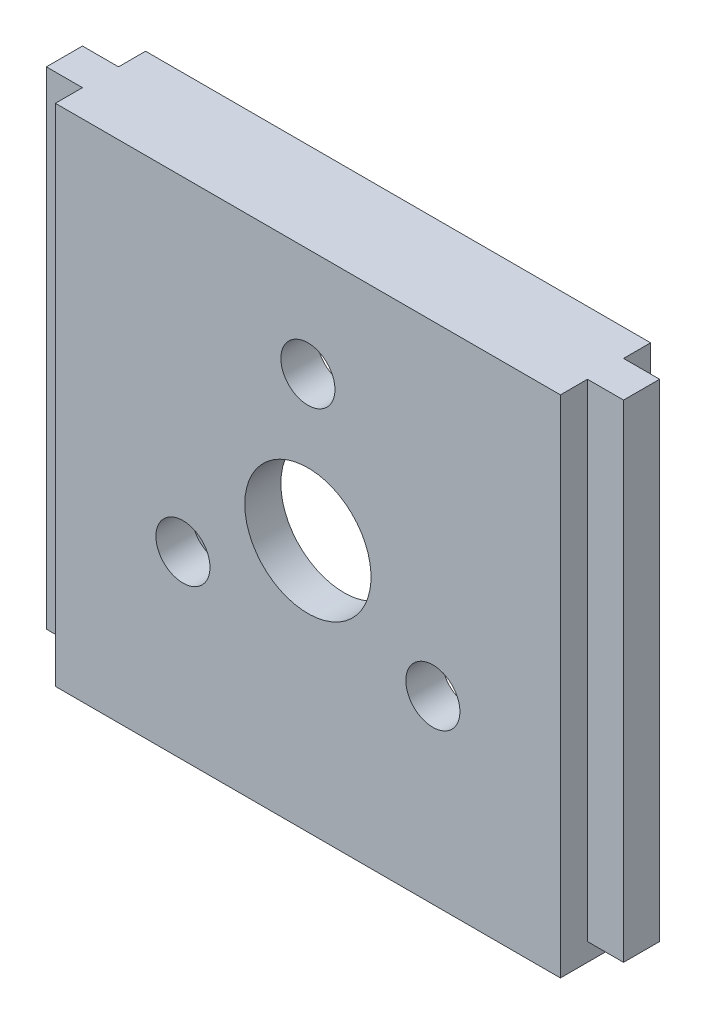
ISO-10303-21;
HEADER;
FILE_DESCRIPTION(('STEP AP214'),'2;1');
FILE_NAME('part.step','',(''),(''),'','','');
FILE_SCHEMA(('AUTOMOTIVE_DESIGN { 1 0 10303 214 1 1 1 1 }'));
ENDSEC;
DATA;
#1=APPLICATION_CONTEXT('core data for automotive mechanical design processes');
#2=APPLICATION_PROTOCOL_DEFINITION('international standard','automotive_design',2000,#1);
#3=PRODUCT_CONTEXT('',#1,'mechanical');
#4=PRODUCT('Part','Part','',(#3));
#5=PRODUCT_RELATED_PRODUCT_CATEGORY('part','',(#4));
#6=PRODUCT_DEFINITION_FORMATION('','',#4);
#7=PRODUCT_DEFINITION_CONTEXT('part definition',#1,'design');
#8=PRODUCT_DEFINITION('design','',#6,#7);
#9=PRODUCT_DEFINITION_SHAPE('','',#8);
#10=(LENGTH_UNIT() NAMED_UNIT(*) SI_UNIT(.MILLI.,.METRE.));
#11=(NAMED_UNIT(*) PLANE_ANGLE_UNIT() SI_UNIT($,.RADIAN.));
#12=(NAMED_UNIT(*) SI_UNIT($,.STERADIAN.) SOLID_ANGLE_UNIT());
#13=UNCERTAINTY_MEASURE_WITH_UNIT(LENGTH_MEASURE(1.E-05),#10,'distance_accuracy_value','');
#14=(GEOMETRIC_REPRESENTATION_CONTEXT(3) GLOBAL_UNCERTAINTY_ASSIGNED_CONTEXT((#13)) GLOBAL_UNIT_ASSIGNED_CONTEXT((#10,
#11,#12)) REPRESENTATION_CONTEXT('',''));
#15=CARTESIAN_POINT('',(0.,0.,0.));
#16=DIRECTION('',(0.,0.,1.));
#17=DIRECTION('',(1.,0.,0.));
#18=AXIS2_PLACEMENT_3D('',#15,#16,#17);
#19=CARTESIAN_POINT('',(14.,14.,0.));
#20=DIRECTION('',(0.,0.,1.));
#21=DIRECTION('',(1.,0.,0.));
#22=AXIS2_PLACEMENT_3D('',#19,#20,#21);
#23=CYLINDRICAL_SURFACE('',#22,3.5);
#24=CARTESIAN_POINT('',(14.,14.,5.));
#25=DIRECTION('',(0.,0.,-1.));
#26=DIRECTION('',(-1.,0.,0.));
#27=AXIS2_PLACEMENT_3D('',#24,#25,#26);
#28=CIRCLE('',#27,3.5);
#29=CARTESIAN_POINT('',(10.5,14.,5.));
#30=VERTEX_POINT('',#29);
#31=EDGE_CURVE('E186',#30,#30,#28,.T.);
#32=ORIENTED_EDGE('',*,*,#31,.F.);
#33=EDGE_LOOP('',(#32));
#34=FACE_BOUND('',#33,.T.);
#35=CARTESIAN_POINT('',(14.,14.,3.));
#36=DIRECTION('',(0.,0.,-1.));
#37=DIRECTION('',(-1.,0.,0.));
#38=AXIS2_PLACEMENT_3D('',#35,#36,#37);
#39=CIRCLE('',#38,3.5);
#40=CARTESIAN_POINT('',(10.5,14.,3.));
#41=VERTEX_POINT('',#40);
#42=EDGE_CURVE('E448',#41,#41,#39,.F.);
#43=ORIENTED_EDGE('',*,*,#42,.F.);
#44=EDGE_LOOP('',(#43));
#45=FACE_BOUND('',#44,.T.);
#46=ADVANCED_FACE('F33',(#34,#45),#23,.F.);
#47=CARTESIAN_POINT('',(7.07179676972451,9.99999999999996,5.));
#48=DIRECTION('',(0.,0.,-1.));
#49=DIRECTION('',(-1.,0.,0.));
#50=AXIS2_PLACEMENT_3D('',#47,#48,#49);
#51=CYLINDRICAL_SURFACE('',#50,1.5);
#52=CARTESIAN_POINT('',(7.07179676972451,9.99999999999996,5.));
#53=DIRECTION('',(0.,0.,-1.));
#54=DIRECTION('',(-1.,0.,0.));
#55=AXIS2_PLACEMENT_3D('',#52,#53,#54);
#56=CIRCLE('',#55,1.5);
#57=CARTESIAN_POINT('',(5.57179676972451,9.99999999999996,5.));
#58=VERTEX_POINT('',#57);
#59=EDGE_CURVE('E151',#58,#58,#56,.T.);
#60=ORIENTED_EDGE('',*,*,#59,.F.);
#61=EDGE_LOOP('',(#60));
#62=FACE_BOUND('',#61,.T.);
#63=CARTESIAN_POINT('',(7.07179676972451,9.99999999999996,3.));
#64=DIRECTION('',(0.,0.,-1.));
#65=DIRECTION('',(-1.,0.,0.));
#66=AXIS2_PLACEMENT_3D('',#63,#64,#65);
#67=CIRCLE('',#66,1.5);
#68=CARTESIAN_POINT('',(5.57179676972451,9.99999999999996,3.));
#69=VERTEX_POINT('',#68);
#70=EDGE_CURVE('E445',#69,#69,#67,.F.);
#71=ORIENTED_EDGE('',*,*,#70,.F.);
#72=EDGE_LOOP('',(#71));
#73=FACE_BOUND('',#72,.T.);
#74=ADVANCED_FACE('F271',(#62,#73),#51,.F.);
#75=CARTESIAN_POINT('',(20.9282032302755,9.99999999999996,5.));
#76=DIRECTION('',(0.,0.,-1.));
#77=DIRECTION('',(-1.,0.,0.));
#78=AXIS2_PLACEMENT_3D('',#75,#76,#77);
#79=CYLINDRICAL_SURFACE('',#78,1.5);
#80=CARTESIAN_POINT('',(20.9282032302755,9.99999999999996,5.));
#81=DIRECTION('',(0.,0.,-1.));
#82=DIRECTION('',(-1.,0.,0.));
#83=AXIS2_PLACEMENT_3D('',#80,#81,#82);
#84=CIRCLE('',#83,1.5);
#85=CARTESIAN_POINT('',(19.4282032302755,9.99999999999996,5.));
#86=VERTEX_POINT('',#85);
#87=EDGE_CURVE('E452',#86,#86,#84,.T.);
#88=ORIENTED_EDGE('',*,*,#87,.F.);
#89=EDGE_LOOP('',(#88));
#90=FACE_BOUND('',#89,.T.);
#91=CARTESIAN_POINT('',(20.9282032302755,9.99999999999996,3.));
#92=DIRECTION('',(0.,0.,-1.));
#93=DIRECTION('',(-1.,0.,0.));
#94=AXIS2_PLACEMENT_3D('',#91,#92,#93);
#95=CIRCLE('',#94,1.5);
#96=CARTESIAN_POINT('',(19.4282032302755,9.99999999999996,3.));
#97=VERTEX_POINT('',#96);
#98=EDGE_CURVE('E442',#97,#97,#95,.F.);
#99=ORIENTED_EDGE('',*,*,#98,.F.);
#100=EDGE_LOOP('',(#99));
#101=FACE_BOUND('',#100,.T.);
#102=ADVANCED_FACE('F277',(#90,#101),#79,.F.);
#103=CARTESIAN_POINT('',(14.,22.,5.));
#104=DIRECTION('',(0.,0.,-1.));
#105=DIRECTION('',(-1.,0.,0.));
#106=AXIS2_PLACEMENT_3D('',#103,#104,#105);
#107=CYLINDRICAL_SURFACE('',#106,1.5);
#108=CARTESIAN_POINT('',(14.,22.,5.));
#109=DIRECTION('',(0.,0.,-1.));
#110=DIRECTION('',(-1.,0.,0.));
#111=AXIS2_PLACEMENT_3D('',#108,#109,#110);
#112=CIRCLE('',#111,1.5);
#113=CARTESIAN_POINT('',(12.5,22.,5.));
#114=VERTEX_POINT('',#113);
#115=EDGE_CURVE('E157',#114,#114,#112,.T.);
#116=ORIENTED_EDGE('',*,*,#115,.F.);
#117=EDGE_LOOP('',(#116));
#118=FACE_BOUND('',#117,.T.);
#119=CARTESIAN_POINT('',(14.,22.,3.));
#120=DIRECTION('',(0.,0.,-1.));
#121=DIRECTION('',(-1.,0.,0.));
#122=AXIS2_PLACEMENT_3D('',#119,#120,#121);
#123=CIRCLE('',#122,1.5);
#124=CARTESIAN_POINT('',(12.5,22.,3.));
#125=VERTEX_POINT('',#124);
#126=EDGE_CURVE('E37',#125,#125,#123,.F.);
#127=ORIENTED_EDGE('',*,*,#126,.F.);
#128=EDGE_LOOP('',(#127));
#129=FACE_BOUND('',#128,.T.);
#130=ADVANCED_FACE('F290',(#118,#129),#107,.F.);
#131=CARTESIAN_POINT('',(28.,0.,5.));
#132=DIRECTION('',(-1.,0.,0.));
#133=DIRECTION('',(0.,-1.,0.));
#134=AXIS2_PLACEMENT_3D('',#131,#132,#133);
#135=PLANE('',#134);
#136=DIRECTION('',(0.,1.,0.));
#137=VECTOR('',#136,1.);
#138=CARTESIAN_POINT('',(28.,1.,1.5));
#139=LINE('',#138,#137);
#140=CARTESIAN_POINT('',(28.,1.,1.5));
#141=VERTEX_POINT('',#140);
#142=CARTESIAN_POINT('',(28.,28.,1.5));
#143=VERTEX_POINT('',#142);
#144=EDGE_CURVE('E144',#141,#143,#139,.T.);
#145=ORIENTED_EDGE('',*,*,#144,.F.);
#146=DIRECTION('',(0.,0.,1.));
#147=VECTOR('',#146,1.);
#148=CARTESIAN_POINT('',(28.,1.,1.5));
#149=LINE('',#148,#147);
#150=CARTESIAN_POINT('',(28.,1.,3.5));
#151=VERTEX_POINT('',#150);
#152=EDGE_CURVE('E136',#141,#151,#149,.T.);
#153=ORIENTED_EDGE('',*,*,#152,.T.);
#154=DIRECTION('',(0.,1.,0.));
#155=VECTOR('',#154,1.);
#156=CARTESIAN_POINT('',(28.,1.,3.5));
#157=LINE('',#156,#155);
#158=CARTESIAN_POINT('',(28.,28.,3.5));
#159=VERTEX_POINT('',#158);
#160=EDGE_CURVE('E121',#151,#159,#157,.T.);
#161=ORIENTED_EDGE('',*,*,#160,.T.);
#162=DIRECTION('',(0.,0.,-1.));
#163=VECTOR('',#162,1.);
#164=CARTESIAN_POINT('',(28.,28.,5.));
#165=LINE('',#164,#163);
#166=CARTESIAN_POINT('',(28.,28.,5.));
#167=VERTEX_POINT('',#166);
#168=EDGE_CURVE('E219',#167,#159,#165,.T.);
#169=ORIENTED_EDGE('',*,*,#168,.F.);
#170=DIRECTION('',(0.,1.,0.));
#171=VECTOR('',#170,1.);
#172=CARTESIAN_POINT('',(28.,0.,5.));
#173=LINE('',#172,#171);
#174=CARTESIAN_POINT('',(28.,0.,5.));
#175=VERTEX_POINT('',#174);
#176=EDGE_CURVE('E201',#175,#167,#173,.T.);
#177=ORIENTED_EDGE('',*,*,#176,.F.);
#178=DIRECTION('',(0.,0.,-1.));
#179=VECTOR('',#178,1.);
#180=CARTESIAN_POINT('',(28.,0.,5.));
#181=LINE('',#180,#179);
#182=CARTESIAN_POINT('',(28.,0.,0.));
#183=VERTEX_POINT('',#182);
#184=EDGE_CURVE('E42',#175,#183,#181,.T.);
#185=ORIENTED_EDGE('',*,*,#184,.T.);
#186=DIRECTION('',(0.,1.,0.));
#187=VECTOR('',#186,1.);
#188=CARTESIAN_POINT('',(28.,0.,0.));
#189=LINE('',#188,#187);
#190=CARTESIAN_POINT('',(28.,28.,0.));
#191=VERTEX_POINT('',#190);
#192=EDGE_CURVE('E210',#183,#191,#189,.T.);
#193=ORIENTED_EDGE('',*,*,#192,.T.);
#194=EDGE_CURVE('E218',#143,#191,#165,.T.);
#195=ORIENTED_EDGE('',*,*,#194,.F.);
#196=EDGE_LOOP('',(#145,#153,#161,#169,#177,#185,#193,#195));
#197=FACE_BOUND('',#196,.T.);
#198=ADVANCED_FACE('F142',(#197),#135,.F.);
#199=CARTESIAN_POINT('',(0.,0.,5.));
#200=DIRECTION('',(1.,0.,0.));
#201=DIRECTION('',(0.,1.,0.));
#202=AXIS2_PLACEMENT_3D('',#199,#200,#201);
#203=PLANE('',#202);
#204=DIRECTION('',(0.,1.,0.));
#205=VECTOR('',#204,1.);
#206=CARTESIAN_POINT('',(0.,1.,3.5));
#207=LINE('',#206,#205);
#208=CARTESIAN_POINT('',(0.,1.,3.5));
#209=VERTEX_POINT('',#208);
#210=CARTESIAN_POINT('',(0.,28.,3.5));
#211=VERTEX_POINT('',#210);
#212=EDGE_CURVE('E184',#209,#211,#207,.T.);
#213=ORIENTED_EDGE('',*,*,#212,.F.);
#214=DIRECTION('',(0.,0.,-1.));
#215=VECTOR('',#214,1.);
#216=CARTESIAN_POINT('',(0.,1.,1.5));
#217=LINE('',#216,#215);
#218=CARTESIAN_POINT('',(0.,1.,1.5));
#219=VERTEX_POINT('',#218);
#220=EDGE_CURVE('E164',#209,#219,#217,.T.);
#221=ORIENTED_EDGE('',*,*,#220,.T.);
#222=DIRECTION('',(0.,1.,0.));
#223=VECTOR('',#222,1.);
#224=CARTESIAN_POINT('',(0.,1.,1.5));
#225=LINE('',#224,#223);
#226=CARTESIAN_POINT('',(0.,28.,1.5));
#227=VERTEX_POINT('',#226);
#228=EDGE_CURVE('E177',#219,#227,#225,.T.);
#229=ORIENTED_EDGE('',*,*,#228,.T.);
#230=DIRECTION('',(0.,0.,-1.));
#231=VECTOR('',#230,1.);
#232=CARTESIAN_POINT('',(0.,28.,5.));
#233=LINE('',#232,#231);
#234=CARTESIAN_POINT('',(0.,28.,0.));
#235=VERTEX_POINT('',#234);
#236=EDGE_CURVE('E205',#227,#235,#233,.T.);
#237=ORIENTED_EDGE('',*,*,#236,.T.);
#238=DIRECTION('',(0.,-1.,0.));
#239=VECTOR('',#238,1.);
#240=CARTESIAN_POINT('',(0.,0.,0.));
#241=LINE('',#240,#239);
#242=CARTESIAN_POINT('',(0.,0.,0.));
#243=VERTEX_POINT('',#242);
#244=EDGE_CURVE('E194',#235,#243,#241,.T.);
#245=ORIENTED_EDGE('',*,*,#244,.T.);
#246=DIRECTION('',(0.,0.,-1.));
#247=VECTOR('',#246,1.);
#248=CARTESIAN_POINT('',(0.,0.,5.));
#249=LINE('',#248,#247);
#250=CARTESIAN_POINT('',(0.,0.,5.));
#251=VERTEX_POINT('',#250);
#252=EDGE_CURVE('E11',#251,#243,#249,.T.);
#253=ORIENTED_EDGE('',*,*,#252,.F.);
#254=DIRECTION('',(0.,-1.,0.));
#255=VECTOR('',#254,1.);
#256=CARTESIAN_POINT('',(0.,0.,5.));
#257=LINE('',#256,#255);
#258=CARTESIAN_POINT('',(0.,28.,5.));
#259=VERTEX_POINT('',#258);
#260=EDGE_CURVE('E195',#259,#251,#257,.T.);
#261=ORIENTED_EDGE('',*,*,#260,.F.);
#262=EDGE_CURVE('E215',#259,#211,#233,.T.);
#263=ORIENTED_EDGE('',*,*,#262,.T.);
#264=EDGE_LOOP('',(#213,#221,#229,#237,#245,#253,#261,#263));
#265=FACE_BOUND('',#264,.T.);
#266=ADVANCED_FACE('F35',(#265),#203,.F.);
#267=CARTESIAN_POINT('',(0.,0.,5.));
#268=DIRECTION('',(0.,1.,0.));
#269=DIRECTION('',(0.,0.,1.));
#270=AXIS2_PLACEMENT_3D('',#267,#268,#269);
#271=PLANE('',#270);
#272=DIRECTION('',(1.,0.,0.));
#273=VECTOR('',#272,1.);
#274=CARTESIAN_POINT('',(0.,0.,0.));
#275=LINE('',#274,#273);
#276=EDGE_CURVE('E208',#243,#183,#275,.T.);
#277=ORIENTED_EDGE('',*,*,#276,.T.);
#278=ORIENTED_EDGE('',*,*,#184,.F.);
#279=DIRECTION('',(1.,0.,0.));
#280=VECTOR('',#279,1.);
#281=CARTESIAN_POINT('',(0.,0.,5.));
#282=LINE('',#281,#280);
#283=EDGE_CURVE('E198',#251,#175,#282,.T.);
#284=ORIENTED_EDGE('',*,*,#283,.F.);
#285=ORIENTED_EDGE('',*,*,#252,.T.);
#286=EDGE_LOOP('',(#277,#278,#284,#285));
#287=FACE_BOUND('',#286,.T.);
#288=ADVANCED_FACE('F245',(#287),#271,.F.);
#289=CARTESIAN_POINT('',(0.,28.,5.));
#290=DIRECTION('',(0.,-1.,0.));
#291=DIRECTION('',(0.,0.,-1.));
#292=AXIS2_PLACEMENT_3D('',#289,#290,#291);
#293=PLANE('',#292);
#294=DIRECTION('',(-1.,0.,0.));
#295=VECTOR('',#294,1.);
#296=CARTESIAN_POINT('',(0.,28.,0.));
#297=LINE('',#296,#295);
#298=EDGE_CURVE('E199',#191,#235,#297,.T.);
#299=ORIENTED_EDGE('',*,*,#298,.T.);
#300=ORIENTED_EDGE('',*,*,#236,.F.);
#301=DIRECTION('',(-1.,0.,0.));
#302=VECTOR('',#301,1.);
#303=CARTESIAN_POINT('',(0.,28.,1.5));
#304=LINE('',#303,#302);
#305=CARTESIAN_POINT('',(-2.,28.,1.5));
#306=VERTEX_POINT('',#305);
#307=EDGE_CURVE('E57',#227,#306,#304,.T.);
#308=ORIENTED_EDGE('',*,*,#307,.T.);
#309=DIRECTION('',(0.,0.,1.));
#310=VECTOR('',#309,1.);
#311=CARTESIAN_POINT('',(-2.,28.,1.5));
#312=LINE('',#311,#310);
#313=CARTESIAN_POINT('',(-2.,28.,3.5));
#314=VERTEX_POINT('',#313);
#315=EDGE_CURVE('E179',#306,#314,#312,.T.);
#316=ORIENTED_EDGE('',*,*,#315,.T.);
#317=DIRECTION('',(1.,0.,0.));
#318=VECTOR('',#317,1.);
#319=CARTESIAN_POINT('',(0.,28.,3.5));
#320=LINE('',#319,#318);
#321=EDGE_CURVE('E168',#314,#211,#320,.T.);
#322=ORIENTED_EDGE('',*,*,#321,.T.);
#323=ORIENTED_EDGE('',*,*,#262,.F.);
#324=DIRECTION('',(-1.,0.,0.));
#325=VECTOR('',#324,1.);
#326=CARTESIAN_POINT('',(0.,28.,5.));
#327=LINE('',#326,#325);
#328=EDGE_CURVE('E203',#167,#259,#327,.T.);
#329=ORIENTED_EDGE('',*,*,#328,.F.);
#330=ORIENTED_EDGE('',*,*,#168,.T.);
#331=DIRECTION('',(1.,0.,0.));
#332=VECTOR('',#331,1.);
#333=CARTESIAN_POINT('',(28.,28.,3.5));
#334=LINE('',#333,#332);
#335=CARTESIAN_POINT('',(30.,28.,3.5));
#336=VERTEX_POINT('',#335);
#337=EDGE_CURVE('E49',#159,#336,#334,.T.);
#338=ORIENTED_EDGE('',*,*,#337,.T.);
#339=DIRECTION('',(0.,0.,-1.));
#340=VECTOR('',#339,1.);
#341=CARTESIAN_POINT('',(30.,28.,1.5));
#342=LINE('',#341,#340);
#343=CARTESIAN_POINT('',(30.,28.,1.5));
#344=VERTEX_POINT('',#343);
#345=EDGE_CURVE('E148',#336,#344,#342,.T.);
#346=ORIENTED_EDGE('',*,*,#345,.T.);
#347=DIRECTION('',(-1.,0.,0.));
#348=VECTOR('',#347,1.);
#349=CARTESIAN_POINT('',(28.,28.,1.5));
#350=LINE('',#349,#348);
#351=EDGE_CURVE('E145',#344,#143,#350,.T.);
#352=ORIENTED_EDGE('',*,*,#351,.T.);
#353=ORIENTED_EDGE('',*,*,#194,.T.);
#354=EDGE_LOOP('',(#299,#300,#308,#316,#322,#323,#329,#330,#338,#346,#352,#353));
#355=FACE_BOUND('',#354,.T.);
#356=ADVANCED_FACE('F232',(#355),#293,.F.);
#357=CARTESIAN_POINT('',(0.,0.,5.));
#358=DIRECTION('',(0.,0.,-1.));
#359=DIRECTION('',(-1.,0.,0.));
#360=AXIS2_PLACEMENT_3D('',#357,#358,#359);
#361=PLANE('',#360);
#362=ORIENTED_EDGE('',*,*,#115,.T.);
#363=EDGE_LOOP('',(#362));
#364=FACE_BOUND('',#363,.T.);
#365=ORIENTED_EDGE('',*,*,#87,.T.);
#366=EDGE_LOOP('',(#365));
#367=FACE_BOUND('',#366,.T.);
#368=ORIENTED_EDGE('',*,*,#59,.T.);
#369=EDGE_LOOP('',(#368));
#370=FACE_BOUND('',#369,.T.);
#371=ORIENTED_EDGE('',*,*,#31,.T.);
#372=EDGE_LOOP('',(#371));
#373=FACE_BOUND('',#372,.T.);
#374=ORIENTED_EDGE('',*,*,#260,.T.);
#375=ORIENTED_EDGE('',*,*,#283,.T.);
#376=ORIENTED_EDGE('',*,*,#176,.T.);
#377=ORIENTED_EDGE('',*,*,#328,.T.);
#378=EDGE_LOOP('',(#374,#375,#376,#377));
#379=FACE_BOUND('',#378,.T.);
#380=ADVANCED_FACE('F243',(#364,#367,#370,#373,#379),#361,.F.);
#381=CARTESIAN_POINT('',(0.,0.,0.));
#382=DIRECTION('',(0.,0.,-1.));
#383=DIRECTION('',(-1.,0.,0.));
#384=AXIS2_PLACEMENT_3D('',#381,#382,#383);
#385=PLANE('',#384);
#386=CARTESIAN_POINT('',(14.,14.,0.));
#387=DIRECTION('',(0.,0.,-1.));
#388=DIRECTION('',(-1.,0.,0.));
#389=AXIS2_PLACEMENT_3D('',#386,#387,#388);
#390=CIRCLE('',#389,12.5);
#391=CARTESIAN_POINT('',(1.5,14.,0.));
#392=VERTEX_POINT('',#391);
#393=EDGE_CURVE('E438',#392,#392,#390,.T.);
#394=ORIENTED_EDGE('',*,*,#393,.F.);
#395=EDGE_LOOP('',(#394));
#396=FACE_BOUND('',#395,.T.);
#397=ORIENTED_EDGE('',*,*,#244,.F.);
#398=ORIENTED_EDGE('',*,*,#298,.F.);
#399=ORIENTED_EDGE('',*,*,#192,.F.);
#400=ORIENTED_EDGE('',*,*,#276,.F.);
#401=EDGE_LOOP('',(#397,#398,#399,#400));
#402=FACE_BOUND('',#401,.T.);
#403=ADVANCED_FACE('F229',(#396,#402),#385,.T.);
#404=CARTESIAN_POINT('',(0.,1.,3.5));
#405=DIRECTION('',(0.,0.,1.));
#406=DIRECTION('',(1.,0.,0.));
#407=AXIS2_PLACEMENT_3D('',#404,#405,#406);
#408=PLANE('',#407);
#409=ORIENTED_EDGE('',*,*,#321,.F.);
#410=DIRECTION('',(0.,1.,0.));
#411=VECTOR('',#410,1.);
#412=CARTESIAN_POINT('',(-2.,1.,3.5));
#413=LINE('',#412,#411);
#414=CARTESIAN_POINT('',(-2.,1.,3.5));
#415=VERTEX_POINT('',#414);
#416=EDGE_CURVE('E187',#415,#314,#413,.T.);
#417=ORIENTED_EDGE('',*,*,#416,.F.);
#418=DIRECTION('',(1.,0.,0.));
#419=VECTOR('',#418,1.);
#420=CARTESIAN_POINT('',(0.,1.,3.5));
#421=LINE('',#420,#419);
#422=EDGE_CURVE('E174',#415,#209,#421,.T.);
#423=ORIENTED_EDGE('',*,*,#422,.T.);
#424=ORIENTED_EDGE('',*,*,#212,.T.);
#425=EDGE_LOOP('',(#409,#417,#423,#424));
#426=FACE_BOUND('',#425,.T.);
#427=ADVANCED_FACE('F259',(#426),#408,.T.);
#428=CARTESIAN_POINT('',(-2.,1.,1.5));
#429=DIRECTION('',(-1.,0.,0.));
#430=DIRECTION('',(0.,0.,1.));
#431=AXIS2_PLACEMENT_3D('',#428,#429,#430);
#432=PLANE('',#431);
#433=ORIENTED_EDGE('',*,*,#315,.F.);
#434=DIRECTION('',(0.,1.,0.));
#435=VECTOR('',#434,1.);
#436=CARTESIAN_POINT('',(-2.,1.,1.5));
#437=LINE('',#436,#435);
#438=CARTESIAN_POINT('',(-2.,1.,1.5));
#439=VERTEX_POINT('',#438);
#440=EDGE_CURVE('E189',#439,#306,#437,.T.);
#441=ORIENTED_EDGE('',*,*,#440,.F.);
#442=DIRECTION('',(0.,0.,1.));
#443=VECTOR('',#442,1.);
#444=CARTESIAN_POINT('',(-2.,1.,1.5));
#445=LINE('',#444,#443);
#446=EDGE_CURVE('E171',#439,#415,#445,.T.);
#447=ORIENTED_EDGE('',*,*,#446,.T.);
#448=ORIENTED_EDGE('',*,*,#416,.T.);
#449=EDGE_LOOP('',(#433,#441,#447,#448));
#450=FACE_BOUND('',#449,.T.);
#451=ADVANCED_FACE('F256',(#450),#432,.T.);
#452=CARTESIAN_POINT('',(0.,1.,1.5));
#453=DIRECTION('',(0.,0.,-1.));
#454=DIRECTION('',(-1.,0.,0.));
#455=AXIS2_PLACEMENT_3D('',#452,#453,#454);
#456=PLANE('',#455);
#457=ORIENTED_EDGE('',*,*,#307,.F.);
#458=ORIENTED_EDGE('',*,*,#228,.F.);
#459=DIRECTION('',(-1.,0.,0.));
#460=VECTOR('',#459,1.);
#461=CARTESIAN_POINT('',(0.,1.,1.5));
#462=LINE('',#461,#460);
#463=EDGE_CURVE('E167',#219,#439,#462,.T.);
#464=ORIENTED_EDGE('',*,*,#463,.T.);
#465=ORIENTED_EDGE('',*,*,#440,.T.);
#466=EDGE_LOOP('',(#457,#458,#464,#465));
#467=FACE_BOUND('',#466,.T.);
#468=ADVANCED_FACE('F249',(#467),#456,.T.);
#469=CARTESIAN_POINT('',(0.,1.,0.));
#470=DIRECTION('',(0.,-1.,0.));
#471=DIRECTION('',(0.,0.,-1.));
#472=AXIS2_PLACEMENT_3D('',#469,#470,#471);
#473=PLANE('',#472);
#474=ORIENTED_EDGE('',*,*,#220,.F.);
#475=ORIENTED_EDGE('',*,*,#422,.F.);
#476=ORIENTED_EDGE('',*,*,#446,.F.);
#477=ORIENTED_EDGE('',*,*,#463,.F.);
#478=EDGE_LOOP('',(#474,#475,#476,#477));
#479=FACE_BOUND('',#478,.T.);
#480=ADVANCED_FACE('F252',(#479),#473,.T.);
#481=CARTESIAN_POINT('',(28.,1.,1.5));
#482=DIRECTION('',(0.,0.,-1.));
#483=DIRECTION('',(-1.,0.,0.));
#484=AXIS2_PLACEMENT_3D('',#481,#482,#483);
#485=PLANE('',#484);
#486=ORIENTED_EDGE('',*,*,#351,.F.);
#487=DIRECTION('',(0.,1.,0.));
#488=VECTOR('',#487,1.);
#489=CARTESIAN_POINT('',(30.,1.,1.5));
#490=LINE('',#489,#488);
#491=CARTESIAN_POINT('',(30.,1.,1.5));
#492=VERTEX_POINT('',#491);
#493=EDGE_CURVE('E161',#492,#344,#490,.T.);
#494=ORIENTED_EDGE('',*,*,#493,.F.);
#495=DIRECTION('',(-1.,0.,0.));
#496=VECTOR('',#495,1.);
#497=CARTESIAN_POINT('',(28.,1.,1.5));
#498=LINE('',#497,#496);
#499=EDGE_CURVE('E130',#492,#141,#498,.T.);
#500=ORIENTED_EDGE('',*,*,#499,.T.);
#501=ORIENTED_EDGE('',*,*,#144,.T.);
#502=EDGE_LOOP('',(#486,#494,#500,#501));
#503=FACE_BOUND('',#502,.T.);
#504=ADVANCED_FACE('F236',(#503),#485,.T.);
#505=CARTESIAN_POINT('',(30.,1.,1.5));
#506=DIRECTION('',(1.,0.,0.));
#507=DIRECTION('',(0.,0.,-1.));
#508=AXIS2_PLACEMENT_3D('',#505,#506,#507);
#509=PLANE('',#508);
#510=ORIENTED_EDGE('',*,*,#345,.F.);
#511=DIRECTION('',(0.,1.,0.));
#512=VECTOR('',#511,1.);
#513=CARTESIAN_POINT('',(30.,1.,3.5));
#514=LINE('',#513,#512);
#515=CARTESIAN_POINT('',(30.,1.,3.5));
#516=VERTEX_POINT('',#515);
#517=EDGE_CURVE('E129',#516,#336,#514,.T.);
#518=ORIENTED_EDGE('',*,*,#517,.F.);
#519=DIRECTION('',(0.,0.,-1.));
#520=VECTOR('',#519,1.);
#521=CARTESIAN_POINT('',(30.,1.,1.5));
#522=LINE('',#521,#520);
#523=EDGE_CURVE('E139',#516,#492,#522,.T.);
#524=ORIENTED_EDGE('',*,*,#523,.T.);
#525=ORIENTED_EDGE('',*,*,#493,.T.);
#526=EDGE_LOOP('',(#510,#518,#524,#525));
#527=FACE_BOUND('',#526,.T.);
#528=ADVANCED_FACE('F238',(#527),#509,.T.);
#529=CARTESIAN_POINT('',(28.,1.,3.5));
#530=DIRECTION('',(0.,0.,1.));
#531=DIRECTION('',(1.,0.,0.));
#532=AXIS2_PLACEMENT_3D('',#529,#530,#531);
#533=PLANE('',#532);
#534=ORIENTED_EDGE('',*,*,#337,.F.);
#535=ORIENTED_EDGE('',*,*,#160,.F.);
#536=DIRECTION('',(1.,0.,0.));
#537=VECTOR('',#536,1.);
#538=CARTESIAN_POINT('',(28.,1.,3.5));
#539=LINE('',#538,#537);
#540=EDGE_CURVE('E124',#151,#516,#539,.T.);
#541=ORIENTED_EDGE('',*,*,#540,.T.);
#542=ORIENTED_EDGE('',*,*,#517,.T.);
#543=EDGE_LOOP('',(#534,#535,#541,#542));
#544=FACE_BOUND('',#543,.T.);
#545=ADVANCED_FACE('F123',(#544),#533,.T.);
#546=CARTESIAN_POINT('',(0.,1.,0.));
#547=DIRECTION('',(0.,1.,0.));
#548=DIRECTION('',(0.,0.,1.));
#549=AXIS2_PLACEMENT_3D('',#546,#547,#548);
#550=PLANE('',#549);
#551=ORIENTED_EDGE('',*,*,#152,.F.);
#552=ORIENTED_EDGE('',*,*,#499,.F.);
#553=ORIENTED_EDGE('',*,*,#523,.F.);
#554=ORIENTED_EDGE('',*,*,#540,.F.);
#555=EDGE_LOOP('',(#551,#552,#553,#554));
#556=FACE_BOUND('',#555,.T.);
#557=ADVANCED_FACE('F134',(#556),#550,.F.);
#558=CARTESIAN_POINT('',(14.,14.,3.));
#559=DIRECTION('',(0.,0.,-1.));
#560=DIRECTION('',(-1.,0.,0.));
#561=AXIS2_PLACEMENT_3D('',#558,#559,#560);
#562=PLANE('',#561);
#563=CARTESIAN_POINT('',(14.,14.,3.));
#564=DIRECTION('',(0.,0.,-1.));
#565=DIRECTION('',(-1.,0.,0.));
#566=AXIS2_PLACEMENT_3D('',#563,#564,#565);
#567=CIRCLE('',#566,12.5);
#568=CARTESIAN_POINT('',(1.5,14.,3.));
#569=VERTEX_POINT('',#568);
#570=EDGE_CURVE('E435',#569,#569,#567,.T.);
#571=ORIENTED_EDGE('',*,*,#570,.T.);
#572=EDGE_LOOP('',(#571));
#573=FACE_BOUND('',#572,.T.);
#574=ORIENTED_EDGE('',*,*,#126,.T.);
#575=EDGE_LOOP('',(#574));
#576=FACE_BOUND('',#575,.T.);
#577=ORIENTED_EDGE('',*,*,#98,.T.);
#578=EDGE_LOOP('',(#577));
#579=FACE_BOUND('',#578,.T.);
#580=ORIENTED_EDGE('',*,*,#70,.T.);
#581=EDGE_LOOP('',(#580));
#582=FACE_BOUND('',#581,.T.);
#583=ORIENTED_EDGE('',*,*,#42,.T.);
#584=EDGE_LOOP('',(#583));
#585=FACE_BOUND('',#584,.T.);
#586=ADVANCED_FACE('F343',(#573,#576,#579,#582,#585),#562,.T.);
#587=CARTESIAN_POINT('',(14.,14.,3.));
#588=DIRECTION('',(0.,0.,-1.));
#589=DIRECTION('',(-1.,0.,0.));
#590=AXIS2_PLACEMENT_3D('',#587,#588,#589);
#591=CYLINDRICAL_SURFACE('',#590,12.5);
#592=ORIENTED_EDGE('',*,*,#570,.F.);
#593=EDGE_LOOP('',(#592));
#594=FACE_BOUND('',#593,.T.);
#595=ORIENTED_EDGE('',*,*,#393,.T.);
#596=EDGE_LOOP('',(#595));
#597=FACE_BOUND('',#596,.T.);
#598=ADVANCED_FACE('F418',(#594,#597),#591,.F.);
#599=CLOSED_SHELL('',(#46,#74,#102,#130,#198,#266,#288,#356,#380,#403,#427,#451,#468,#480,#504,
#528,#545,#557,#586,#598));
#600=MANIFOLD_SOLID_BREP('B2',#599);
#601=ADVANCED_BREP_SHAPE_REPRESENTATION('',(#18,#600),#14);
#602=SHAPE_DEFINITION_REPRESENTATION(#9,#601);
ENDSEC;
END-ISO-10303-21;
